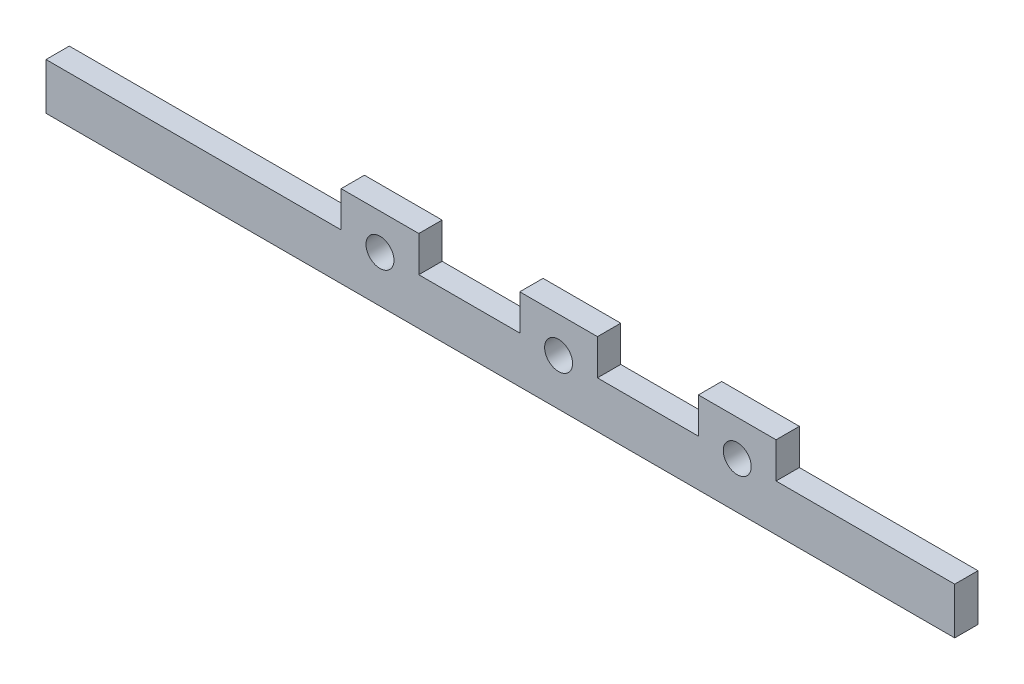
ISO-10303-21;
HEADER;
FILE_DESCRIPTION(('STEP AP214'),'2;1');
FILE_NAME('part.step','',(''),(''),'','','');
FILE_SCHEMA(('AUTOMOTIVE_DESIGN { 1 0 10303 214 1 1 1 1 }'));
ENDSEC;
DATA;
#1=APPLICATION_CONTEXT('core data for automotive mechanical design processes');
#2=APPLICATION_PROTOCOL_DEFINITION('international standard','automotive_design',2000,#1);
#3=PRODUCT_CONTEXT('',#1,'mechanical');
#4=PRODUCT('Part','Part','',(#3));
#5=PRODUCT_RELATED_PRODUCT_CATEGORY('part','',(#4));
#6=PRODUCT_DEFINITION_FORMATION('','',#4);
#7=PRODUCT_DEFINITION_CONTEXT('part definition',#1,'design');
#8=PRODUCT_DEFINITION('design','',#6,#7);
#9=PRODUCT_DEFINITION_SHAPE('','',#8);
#10=(LENGTH_UNIT() NAMED_UNIT(*) SI_UNIT(.MILLI.,.METRE.));
#11=(NAMED_UNIT(*) PLANE_ANGLE_UNIT() SI_UNIT($,.RADIAN.));
#12=(NAMED_UNIT(*) SI_UNIT($,.STERADIAN.) SOLID_ANGLE_UNIT());
#13=UNCERTAINTY_MEASURE_WITH_UNIT(LENGTH_MEASURE(1.E-05),#10,'distance_accuracy_value','');
#14=(GEOMETRIC_REPRESENTATION_CONTEXT(3) GLOBAL_UNCERTAINTY_ASSIGNED_CONTEXT((#13)) GLOBAL_UNIT_ASSIGNED_CONTEXT((#10,
#11,#12)) REPRESENTATION_CONTEXT('',''));
#15=CARTESIAN_POINT('',(0.,0.,0.));
#16=DIRECTION('',(0.,0.,1.));
#17=DIRECTION('',(1.,0.,0.));
#18=AXIS2_PLACEMENT_3D('',#15,#16,#17);
#19=CARTESIAN_POINT('',(0.,0.,15.));
#20=DIRECTION('',(0.,0.,-1.));
#21=DIRECTION('',(-1.,0.,0.));
#22=AXIS2_PLACEMENT_3D('',#19,#20,#21);
#23=PLANE('',#22);
#24=CARTESIAN_POINT('',(-77.5,30.0000000000001,15.));
#25=DIRECTION('',(0.,0.,1.));
#26=DIRECTION('',(1.,0.,0.));
#27=AXIS2_PLACEMENT_3D('',#24,#25,#26);
#28=CIRCLE('',#27,9.00000000000001);
#29=CARTESIAN_POINT('',(-68.4999999999999,30.0000000000001,15.));
#30=VERTEX_POINT('',#29);
#31=EDGE_CURVE('E339',#30,#30,#28,.T.);
#32=ORIENTED_EDGE('',*,*,#31,.F.);
#33=EDGE_LOOP('',(#32));
#34=FACE_BOUND('',#33,.T.);
#35=DIRECTION('',(0.,1.,0.));
#36=VECTOR('',#35,1.);
#37=CARTESIAN_POINT('',(62.5,30.,15.));
#38=LINE('',#37,#36);
#39=CARTESIAN_POINT('',(62.5,30.,15.));
#40=VERTEX_POINT('',#39);
#41=CARTESIAN_POINT('',(62.5,53.,15.));
#42=VERTEX_POINT('',#41);
#43=EDGE_CURVE('E209',#40,#42,#38,.T.);
#44=ORIENTED_EDGE('',*,*,#43,.T.);
#45=DIRECTION('',(-1.,0.,0.));
#46=VECTOR('',#45,1.);
#47=CARTESIAN_POINT('',(12.5,53.,15.));
#48=LINE('',#47,#46);
#49=CARTESIAN_POINT('',(12.5,53.,15.));
#50=VERTEX_POINT('',#49);
#51=EDGE_CURVE('E117',#42,#50,#48,.T.);
#52=ORIENTED_EDGE('',*,*,#51,.T.);
#53=DIRECTION('',(0.,-1.,0.));
#54=VECTOR('',#53,1.);
#55=CARTESIAN_POINT('',(12.5,30.,15.));
#56=LINE('',#55,#54);
#57=CARTESIAN_POINT('',(12.5,30.,15.));
#58=VERTEX_POINT('',#57);
#59=EDGE_CURVE('E248',#50,#58,#56,.T.);
#60=ORIENTED_EDGE('',*,*,#59,.T.);
#61=DIRECTION('',(-1.,0.,0.));
#62=VECTOR('',#61,1.);
#63=CARTESIAN_POINT('',(12.5,30.,15.));
#64=LINE('',#63,#62);
#65=CARTESIAN_POINT('',(-52.5,30.,15.));
#66=VERTEX_POINT('',#65);
#67=EDGE_CURVE('E267',#58,#66,#64,.T.);
#68=ORIENTED_EDGE('',*,*,#67,.T.);
#69=DIRECTION('',(0.,1.,0.));
#70=VECTOR('',#69,1.);
#71=CARTESIAN_POINT('',(-52.5,30.,15.));
#72=LINE('',#71,#70);
#73=CARTESIAN_POINT('',(-52.5,53.,15.));
#74=VERTEX_POINT('',#73);
#75=EDGE_CURVE('E264',#66,#74,#72,.T.);
#76=ORIENTED_EDGE('',*,*,#75,.T.);
#77=DIRECTION('',(-1.,0.,0.));
#78=VECTOR('',#77,1.);
#79=CARTESIAN_POINT('',(-102.5,53.,15.));
#80=LINE('',#79,#78);
#81=CARTESIAN_POINT('',(-102.5,53.,15.));
#82=VERTEX_POINT('',#81);
#83=EDGE_CURVE('E266',#74,#82,#80,.T.);
#84=ORIENTED_EDGE('',*,*,#83,.T.);
#85=DIRECTION('',(0.,-1.,0.));
#86=VECTOR('',#85,1.);
#87=CARTESIAN_POINT('',(-102.5,30.,15.));
#88=LINE('',#87,#86);
#89=CARTESIAN_POINT('',(-102.5,30.,15.));
#90=VERTEX_POINT('',#89);
#91=EDGE_CURVE('E269',#82,#90,#88,.T.);
#92=ORIENTED_EDGE('',*,*,#91,.T.);
#93=DIRECTION('',(-1.,0.,0.));
#94=VECTOR('',#93,1.);
#95=CARTESIAN_POINT('',(-102.5,30.,15.));
#96=LINE('',#95,#94);
#97=CARTESIAN_POINT('',(-292.5,30.,15.));
#98=VERTEX_POINT('',#97);
#99=EDGE_CURVE('E275',#90,#98,#96,.T.);
#100=ORIENTED_EDGE('',*,*,#99,.T.);
#101=DIRECTION('',(0.,-1.,0.));
#102=VECTOR('',#101,1.);
#103=CARTESIAN_POINT('',(-292.5,0.,15.));
#104=LINE('',#103,#102);
#105=CARTESIAN_POINT('',(-292.5,0.,15.));
#106=VERTEX_POINT('',#105);
#107=EDGE_CURVE('E277',#98,#106,#104,.T.);
#108=ORIENTED_EDGE('',*,*,#107,.T.);
#109=DIRECTION('',(1.,0.,0.));
#110=VECTOR('',#109,1.);
#111=CARTESIAN_POINT('',(-292.5,0.,15.));
#112=LINE('',#111,#110);
#113=CARTESIAN_POINT('',(292.5,0.,15.));
#114=VERTEX_POINT('',#113);
#115=EDGE_CURVE('E279',#106,#114,#112,.T.);
#116=ORIENTED_EDGE('',*,*,#115,.T.);
#117=DIRECTION('',(0.,1.,0.));
#118=VECTOR('',#117,1.);
#119=CARTESIAN_POINT('',(292.5,0.,15.));
#120=LINE('',#119,#118);
#121=CARTESIAN_POINT('',(292.5,30.,15.));
#122=VERTEX_POINT('',#121);
#123=EDGE_CURVE('E281',#114,#122,#120,.T.);
#124=ORIENTED_EDGE('',*,*,#123,.T.);
#125=DIRECTION('',(-1.,0.,0.));
#126=VECTOR('',#125,1.);
#127=CARTESIAN_POINT('',(177.5,30.0000000000001,15.));
#128=LINE('',#127,#126);
#129=CARTESIAN_POINT('',(177.5,30.0000000000001,15.));
#130=VERTEX_POINT('',#129);
#131=EDGE_CURVE('E283',#122,#130,#128,.T.);
#132=ORIENTED_EDGE('',*,*,#131,.T.);
#133=DIRECTION('',(0.,1.,0.));
#134=VECTOR('',#133,1.);
#135=CARTESIAN_POINT('',(177.5,30.0000000000001,15.));
#136=LINE('',#135,#134);
#137=CARTESIAN_POINT('',(177.5,53.,15.));
#138=VERTEX_POINT('',#137);
#139=EDGE_CURVE('E160',#130,#138,#136,.T.);
#140=ORIENTED_EDGE('',*,*,#139,.T.);
#141=DIRECTION('',(-1.,0.,0.));
#142=VECTOR('',#141,1.);
#143=CARTESIAN_POINT('',(127.5,53.,15.));
#144=LINE('',#143,#142);
#145=CARTESIAN_POINT('',(127.5,53.,15.));
#146=VERTEX_POINT('',#145);
#147=EDGE_CURVE('E154',#138,#146,#144,.T.);
#148=ORIENTED_EDGE('',*,*,#147,.T.);
#149=DIRECTION('',(0.,-1.,0.));
#150=VECTOR('',#149,1.);
#151=CARTESIAN_POINT('',(127.5,30.0000000000001,15.));
#152=LINE('',#151,#150);
#153=CARTESIAN_POINT('',(127.5,30.0000000000001,15.));
#154=VERTEX_POINT('',#153);
#155=EDGE_CURVE('E158',#146,#154,#152,.T.);
#156=ORIENTED_EDGE('',*,*,#155,.T.);
#157=DIRECTION('',(-1.,0.,0.));
#158=VECTOR('',#157,1.);
#159=CARTESIAN_POINT('',(62.5,30.,15.));
#160=LINE('',#159,#158);
#161=EDGE_CURVE('E50',#154,#40,#160,.T.);
#162=ORIENTED_EDGE('',*,*,#161,.T.);
#163=EDGE_LOOP('',(#44,#52,#60,#68,#76,#84,#92,#100,#108,#116,#124,#132,#140,#148,#156,#162));
#164=FACE_BOUND('',#163,.T.);
#165=CARTESIAN_POINT('',(37.5,30.,15.));
#166=DIRECTION('',(0.,0.,1.));
#167=DIRECTION('',(1.,0.,0.));
#168=AXIS2_PLACEMENT_3D('',#165,#166,#167);
#169=CIRCLE('',#168,9.);
#170=CARTESIAN_POINT('',(46.5,30.,15.));
#171=VERTEX_POINT('',#170);
#172=EDGE_CURVE('E182',#171,#171,#169,.T.);
#173=ORIENTED_EDGE('',*,*,#172,.F.);
#174=EDGE_LOOP('',(#173));
#175=FACE_BOUND('',#174,.T.);
#176=CARTESIAN_POINT('',(152.5,30.0000000000001,15.));
#177=DIRECTION('',(0.,0.,1.));
#178=DIRECTION('',(1.,0.,0.));
#179=AXIS2_PLACEMENT_3D('',#176,#177,#178);
#180=CIRCLE('',#179,9.00000000000001);
#181=CARTESIAN_POINT('',(161.5,30.0000000000001,15.));
#182=VERTEX_POINT('',#181);
#183=EDGE_CURVE('E330',#182,#182,#180,.T.);
#184=ORIENTED_EDGE('',*,*,#183,.F.);
#185=EDGE_LOOP('',(#184));
#186=FACE_BOUND('',#185,.T.);
#187=ADVANCED_FACE('F33',(#34,#164,#175,#186),#23,.F.);
#188=CARTESIAN_POINT('',(0.,0.,0.));
#189=DIRECTION('',(0.,0.,-1.));
#190=DIRECTION('',(-1.,0.,0.));
#191=AXIS2_PLACEMENT_3D('',#188,#189,#190);
#192=PLANE('',#191);
#193=CARTESIAN_POINT('',(-77.5,30.0000000000001,0.));
#194=DIRECTION('',(0.,0.,1.));
#195=DIRECTION('',(1.,0.,0.));
#196=AXIS2_PLACEMENT_3D('',#193,#194,#195);
#197=CIRCLE('',#196,9.00000000000001);
#198=CARTESIAN_POINT('',(-68.4999999999999,30.0000000000001,0.));
#199=VERTEX_POINT('',#198);
#200=EDGE_CURVE('E336',#199,#199,#197,.T.);
#201=ORIENTED_EDGE('',*,*,#200,.T.);
#202=EDGE_LOOP('',(#201));
#203=FACE_BOUND('',#202,.T.);
#204=DIRECTION('',(0.,1.,0.));
#205=VECTOR('',#204,1.);
#206=CARTESIAN_POINT('',(62.5,30.,0.));
#207=LINE('',#206,#205);
#208=CARTESIAN_POINT('',(62.5,30.,0.));
#209=VERTEX_POINT('',#208);
#210=CARTESIAN_POINT('',(62.5,53.,0.));
#211=VERTEX_POINT('',#210);
#212=EDGE_CURVE('E178',#209,#211,#207,.T.);
#213=ORIENTED_EDGE('',*,*,#212,.F.);
#214=DIRECTION('',(-1.,0.,0.));
#215=VECTOR('',#214,1.);
#216=CARTESIAN_POINT('',(62.5,30.,0.));
#217=LINE('',#216,#215);
#218=CARTESIAN_POINT('',(127.5,30.0000000000001,0.));
#219=VERTEX_POINT('',#218);
#220=EDGE_CURVE('E109',#219,#209,#217,.T.);
#221=ORIENTED_EDGE('',*,*,#220,.F.);
#222=DIRECTION('',(0.,-1.,0.));
#223=VECTOR('',#222,1.);
#224=CARTESIAN_POINT('',(127.5,30.0000000000001,0.));
#225=LINE('',#224,#223);
#226=CARTESIAN_POINT('',(127.5,53.,0.));
#227=VERTEX_POINT('',#226);
#228=EDGE_CURVE('E103',#227,#219,#225,.T.);
#229=ORIENTED_EDGE('',*,*,#228,.F.);
#230=DIRECTION('',(-1.,0.,0.));
#231=VECTOR('',#230,1.);
#232=CARTESIAN_POINT('',(127.5,53.,0.));
#233=LINE('',#232,#231);
#234=CARTESIAN_POINT('',(177.5,53.,0.));
#235=VERTEX_POINT('',#234);
#236=EDGE_CURVE('E168',#235,#227,#233,.T.);
#237=ORIENTED_EDGE('',*,*,#236,.F.);
#238=DIRECTION('',(0.,1.,0.));
#239=VECTOR('',#238,1.);
#240=CARTESIAN_POINT('',(177.5,30.0000000000001,0.));
#241=LINE('',#240,#239);
#242=CARTESIAN_POINT('',(177.5,30.0000000000001,0.));
#243=VERTEX_POINT('',#242);
#244=EDGE_CURVE('E204',#243,#235,#241,.T.);
#245=ORIENTED_EDGE('',*,*,#244,.F.);
#246=DIRECTION('',(-1.,0.,0.));
#247=VECTOR('',#246,1.);
#248=CARTESIAN_POINT('',(177.5,30.0000000000001,0.));
#249=LINE('',#248,#247);
#250=CARTESIAN_POINT('',(292.5,30.,0.));
#251=VERTEX_POINT('',#250);
#252=EDGE_CURVE('E202',#251,#243,#249,.T.);
#253=ORIENTED_EDGE('',*,*,#252,.F.);
#254=DIRECTION('',(0.,1.,0.));
#255=VECTOR('',#254,1.);
#256=CARTESIAN_POINT('',(292.5,0.,0.));
#257=LINE('',#256,#255);
#258=CARTESIAN_POINT('',(292.5,0.,0.));
#259=VERTEX_POINT('',#258);
#260=EDGE_CURVE('E200',#259,#251,#257,.T.);
#261=ORIENTED_EDGE('',*,*,#260,.F.);
#262=DIRECTION('',(1.,0.,0.));
#263=VECTOR('',#262,1.);
#264=CARTESIAN_POINT('',(-292.5,0.,0.));
#265=LINE('',#264,#263);
#266=CARTESIAN_POINT('',(-292.5,0.,0.));
#267=VERTEX_POINT('',#266);
#268=EDGE_CURVE('E198',#267,#259,#265,.T.);
#269=ORIENTED_EDGE('',*,*,#268,.F.);
#270=DIRECTION('',(0.,-1.,0.));
#271=VECTOR('',#270,1.);
#272=CARTESIAN_POINT('',(-292.5,0.,0.));
#273=LINE('',#272,#271);
#274=CARTESIAN_POINT('',(-292.5,30.,0.));
#275=VERTEX_POINT('',#274);
#276=EDGE_CURVE('E196',#275,#267,#273,.T.);
#277=ORIENTED_EDGE('',*,*,#276,.F.);
#278=DIRECTION('',(-1.,0.,0.));
#279=VECTOR('',#278,1.);
#280=CARTESIAN_POINT('',(-102.5,30.,0.));
#281=LINE('',#280,#279);
#282=CARTESIAN_POINT('',(-102.5,30.,0.));
#283=VERTEX_POINT('',#282);
#284=EDGE_CURVE('E194',#283,#275,#281,.T.);
#285=ORIENTED_EDGE('',*,*,#284,.F.);
#286=DIRECTION('',(0.,-1.,0.));
#287=VECTOR('',#286,1.);
#288=CARTESIAN_POINT('',(-102.5,30.,0.));
#289=LINE('',#288,#287);
#290=CARTESIAN_POINT('',(-102.5,53.,0.));
#291=VERTEX_POINT('',#290);
#292=EDGE_CURVE('E192',#291,#283,#289,.T.);
#293=ORIENTED_EDGE('',*,*,#292,.F.);
#294=DIRECTION('',(-1.,0.,0.));
#295=VECTOR('',#294,1.);
#296=CARTESIAN_POINT('',(-102.5,53.,0.));
#297=LINE('',#296,#295);
#298=CARTESIAN_POINT('',(-52.5,53.,0.));
#299=VERTEX_POINT('',#298);
#300=EDGE_CURVE('E190',#299,#291,#297,.T.);
#301=ORIENTED_EDGE('',*,*,#300,.F.);
#302=DIRECTION('',(0.,1.,0.));
#303=VECTOR('',#302,1.);
#304=CARTESIAN_POINT('',(-52.5,30.,0.));
#305=LINE('',#304,#303);
#306=CARTESIAN_POINT('',(-52.5,30.,0.));
#307=VERTEX_POINT('',#306);
#308=EDGE_CURVE('E188',#307,#299,#305,.T.);
#309=ORIENTED_EDGE('',*,*,#308,.F.);
#310=DIRECTION('',(-1.,0.,0.));
#311=VECTOR('',#310,1.);
#312=CARTESIAN_POINT('',(12.5,30.,0.));
#313=LINE('',#312,#311);
#314=CARTESIAN_POINT('',(12.5,30.,0.));
#315=VERTEX_POINT('',#314);
#316=EDGE_CURVE('E186',#315,#307,#313,.T.);
#317=ORIENTED_EDGE('',*,*,#316,.F.);
#318=DIRECTION('',(0.,-1.,0.));
#319=VECTOR('',#318,1.);
#320=CARTESIAN_POINT('',(12.5,30.,0.));
#321=LINE('',#320,#319);
#322=CARTESIAN_POINT('',(12.5,53.,0.));
#323=VERTEX_POINT('',#322);
#324=EDGE_CURVE('E184',#323,#315,#321,.T.);
#325=ORIENTED_EDGE('',*,*,#324,.F.);
#326=DIRECTION('',(-1.,0.,0.));
#327=VECTOR('',#326,1.);
#328=CARTESIAN_POINT('',(12.5,53.,0.));
#329=LINE('',#328,#327);
#330=EDGE_CURVE('E181',#211,#323,#329,.T.);
#331=ORIENTED_EDGE('',*,*,#330,.F.);
#332=EDGE_LOOP('',(#213,#221,#229,#237,#245,#253,#261,#269,#277,#285,#293,#301,#309,#317,#325,#331));
#333=FACE_BOUND('',#332,.T.);
#334=CARTESIAN_POINT('',(37.5,30.,0.));
#335=DIRECTION('',(0.,0.,1.));
#336=DIRECTION('',(1.,0.,0.));
#337=AXIS2_PLACEMENT_3D('',#334,#335,#336);
#338=CIRCLE('',#337,9.);
#339=CARTESIAN_POINT('',(46.5,30.,0.));
#340=VERTEX_POINT('',#339);
#341=EDGE_CURVE('E342',#340,#340,#338,.T.);
#342=ORIENTED_EDGE('',*,*,#341,.T.);
#343=EDGE_LOOP('',(#342));
#344=FACE_BOUND('',#343,.T.);
#345=CARTESIAN_POINT('',(152.5,30.0000000000001,0.));
#346=DIRECTION('',(0.,0.,1.));
#347=DIRECTION('',(1.,0.,0.));
#348=AXIS2_PLACEMENT_3D('',#345,#346,#347);
#349=CIRCLE('',#348,9.00000000000001);
#350=CARTESIAN_POINT('',(161.5,30.0000000000001,0.));
#351=VERTEX_POINT('',#350);
#352=EDGE_CURVE('E333',#351,#351,#349,.T.);
#353=ORIENTED_EDGE('',*,*,#352,.T.);
#354=EDGE_LOOP('',(#353));
#355=FACE_BOUND('',#354,.T.);
#356=ADVANCED_FACE('F252',(#203,#333,#344,#355),#192,.T.);
#357=CARTESIAN_POINT('',(62.5,30.,15.));
#358=DIRECTION('',(-1.,0.,0.));
#359=DIRECTION('',(0.,0.,1.));
#360=AXIS2_PLACEMENT_3D('',#357,#358,#359);
#361=PLANE('',#360);
#362=ORIENTED_EDGE('',*,*,#212,.T.);
#363=DIRECTION('',(0.,0.,-1.));
#364=VECTOR('',#363,1.);
#365=CARTESIAN_POINT('',(62.5,53.,15.));
#366=LINE('',#365,#364);
#367=EDGE_CURVE('E11',#42,#211,#366,.T.);
#368=ORIENTED_EDGE('',*,*,#367,.F.);
#369=ORIENTED_EDGE('',*,*,#43,.F.);
#370=DIRECTION('',(0.,0.,-1.));
#371=VECTOR('',#370,1.);
#372=CARTESIAN_POINT('',(62.5,30.,15.));
#373=LINE('',#372,#371);
#374=EDGE_CURVE('E174',#40,#209,#373,.T.);
#375=ORIENTED_EDGE('',*,*,#374,.T.);
#376=EDGE_LOOP('',(#362,#368,#369,#375));
#377=FACE_BOUND('',#376,.T.);
#378=ADVANCED_FACE('F35',(#377),#361,.F.);
#379=CARTESIAN_POINT('',(12.5,53.,15.));
#380=DIRECTION('',(0.,-1.,0.));
#381=DIRECTION('',(0.,0.,-1.));
#382=AXIS2_PLACEMENT_3D('',#379,#380,#381);
#383=PLANE('',#382);
#384=ORIENTED_EDGE('',*,*,#330,.T.);
#385=DIRECTION('',(0.,0.,-1.));
#386=VECTOR('',#385,1.);
#387=CARTESIAN_POINT('',(12.5,53.,15.));
#388=LINE('',#387,#386);
#389=EDGE_CURVE('E42',#50,#323,#388,.T.);
#390=ORIENTED_EDGE('',*,*,#389,.F.);
#391=ORIENTED_EDGE('',*,*,#51,.F.);
#392=ORIENTED_EDGE('',*,*,#367,.T.);
#393=EDGE_LOOP('',(#384,#390,#391,#392));
#394=FACE_BOUND('',#393,.T.);
#395=ADVANCED_FACE('F483',(#394),#383,.F.);
#396=CARTESIAN_POINT('',(12.5,30.,15.));
#397=DIRECTION('',(1.,0.,0.));
#398=DIRECTION('',(0.,0.,-1.));
#399=AXIS2_PLACEMENT_3D('',#396,#397,#398);
#400=PLANE('',#399);
#401=ORIENTED_EDGE('',*,*,#324,.T.);
#402=DIRECTION('',(0.,0.,-1.));
#403=VECTOR('',#402,1.);
#404=CARTESIAN_POINT('',(12.5,30.,15.));
#405=LINE('',#404,#403);
#406=EDGE_CURVE('E240',#58,#315,#405,.T.);
#407=ORIENTED_EDGE('',*,*,#406,.F.);
#408=ORIENTED_EDGE('',*,*,#59,.F.);
#409=ORIENTED_EDGE('',*,*,#389,.T.);
#410=EDGE_LOOP('',(#401,#407,#408,#409));
#411=FACE_BOUND('',#410,.T.);
#412=ADVANCED_FACE('F246',(#411),#400,.F.);
#413=CARTESIAN_POINT('',(12.5,30.,15.));
#414=DIRECTION('',(0.,-1.,0.));
#415=DIRECTION('',(1.,0.,0.));
#416=AXIS2_PLACEMENT_3D('',#413,#414,#415);
#417=PLANE('',#416);
#418=ORIENTED_EDGE('',*,*,#316,.T.);
#419=DIRECTION('',(0.,0.,-1.));
#420=VECTOR('',#419,1.);
#421=CARTESIAN_POINT('',(-52.5,30.,15.));
#422=LINE('',#421,#420);
#423=EDGE_CURVE('E237',#66,#307,#422,.T.);
#424=ORIENTED_EDGE('',*,*,#423,.F.);
#425=ORIENTED_EDGE('',*,*,#67,.F.);
#426=ORIENTED_EDGE('',*,*,#406,.T.);
#427=EDGE_LOOP('',(#418,#424,#425,#426));
#428=FACE_BOUND('',#427,.T.);
#429=ADVANCED_FACE('F258',(#428),#417,.F.);
#430=CARTESIAN_POINT('',(-52.5,30.,15.));
#431=DIRECTION('',(-1.,0.,0.));
#432=DIRECTION('',(0.,0.,1.));
#433=AXIS2_PLACEMENT_3D('',#430,#431,#432);
#434=PLANE('',#433);
#435=ORIENTED_EDGE('',*,*,#308,.T.);
#436=DIRECTION('',(0.,0.,-1.));
#437=VECTOR('',#436,1.);
#438=CARTESIAN_POINT('',(-52.5,53.,15.));
#439=LINE('',#438,#437);
#440=EDGE_CURVE('E234',#74,#299,#439,.T.);
#441=ORIENTED_EDGE('',*,*,#440,.F.);
#442=ORIENTED_EDGE('',*,*,#75,.F.);
#443=ORIENTED_EDGE('',*,*,#423,.T.);
#444=EDGE_LOOP('',(#435,#441,#442,#443));
#445=FACE_BOUND('',#444,.T.);
#446=ADVANCED_FACE('F262',(#445),#434,.F.);
#447=CARTESIAN_POINT('',(-102.5,53.,15.));
#448=DIRECTION('',(0.,-1.,0.));
#449=DIRECTION('',(0.,0.,-1.));
#450=AXIS2_PLACEMENT_3D('',#447,#448,#449);
#451=PLANE('',#450);
#452=ORIENTED_EDGE('',*,*,#300,.T.);
#453=DIRECTION('',(0.,0.,-1.));
#454=VECTOR('',#453,1.);
#455=CARTESIAN_POINT('',(-102.5,53.,15.));
#456=LINE('',#455,#454);
#457=EDGE_CURVE('E231',#82,#291,#456,.T.);
#458=ORIENTED_EDGE('',*,*,#457,.F.);
#459=ORIENTED_EDGE('',*,*,#83,.F.);
#460=ORIENTED_EDGE('',*,*,#440,.T.);
#461=EDGE_LOOP('',(#452,#458,#459,#460));
#462=FACE_BOUND('',#461,.T.);
#463=ADVANCED_FACE('F448',(#462),#451,.F.);
#464=CARTESIAN_POINT('',(-102.5,30.,15.));
#465=DIRECTION('',(1.,0.,0.));
#466=DIRECTION('',(0.,0.,-1.));
#467=AXIS2_PLACEMENT_3D('',#464,#465,#466);
#468=PLANE('',#467);
#469=ORIENTED_EDGE('',*,*,#292,.T.);
#470=DIRECTION('',(0.,0.,-1.));
#471=VECTOR('',#470,1.);
#472=CARTESIAN_POINT('',(-102.5,30.,15.));
#473=LINE('',#472,#471);
#474=EDGE_CURVE('E228',#90,#283,#473,.T.);
#475=ORIENTED_EDGE('',*,*,#474,.F.);
#476=ORIENTED_EDGE('',*,*,#91,.F.);
#477=ORIENTED_EDGE('',*,*,#457,.T.);
#478=EDGE_LOOP('',(#469,#475,#476,#477));
#479=FACE_BOUND('',#478,.T.);
#480=ADVANCED_FACE('F438',(#479),#468,.F.);
#481=CARTESIAN_POINT('',(-102.5,30.,15.));
#482=DIRECTION('',(0.,-1.,0.));
#483=DIRECTION('',(1.,0.,0.));
#484=AXIS2_PLACEMENT_3D('',#481,#482,#483);
#485=PLANE('',#484);
#486=ORIENTED_EDGE('',*,*,#284,.T.);
#487=DIRECTION('',(0.,0.,-1.));
#488=VECTOR('',#487,1.);
#489=CARTESIAN_POINT('',(-292.5,30.,15.));
#490=LINE('',#489,#488);
#491=EDGE_CURVE('E225',#98,#275,#490,.T.);
#492=ORIENTED_EDGE('',*,*,#491,.F.);
#493=ORIENTED_EDGE('',*,*,#99,.F.);
#494=ORIENTED_EDGE('',*,*,#474,.T.);
#495=EDGE_LOOP('',(#486,#492,#493,#494));
#496=FACE_BOUND('',#495,.T.);
#497=ADVANCED_FACE('F428',(#496),#485,.F.);
#498=CARTESIAN_POINT('',(-292.5,0.,15.));
#499=DIRECTION('',(1.,0.,0.));
#500=DIRECTION('',(0.,0.,-1.));
#501=AXIS2_PLACEMENT_3D('',#498,#499,#500);
#502=PLANE('',#501);
#503=ORIENTED_EDGE('',*,*,#276,.T.);
#504=DIRECTION('',(0.,0.,-1.));
#505=VECTOR('',#504,1.);
#506=CARTESIAN_POINT('',(-292.5,0.,15.));
#507=LINE('',#506,#505);
#508=EDGE_CURVE('E222',#106,#267,#507,.T.);
#509=ORIENTED_EDGE('',*,*,#508,.F.);
#510=ORIENTED_EDGE('',*,*,#107,.F.);
#511=ORIENTED_EDGE('',*,*,#491,.T.);
#512=EDGE_LOOP('',(#503,#509,#510,#511));
#513=FACE_BOUND('',#512,.T.);
#514=ADVANCED_FACE('F418',(#513),#502,.F.);
#515=CARTESIAN_POINT('',(-292.5,0.,15.));
#516=DIRECTION('',(0.,1.,0.));
#517=DIRECTION('',(0.,0.,1.));
#518=AXIS2_PLACEMENT_3D('',#515,#516,#517);
#519=PLANE('',#518);
#520=ORIENTED_EDGE('',*,*,#268,.T.);
#521=DIRECTION('',(0.,0.,-1.));
#522=VECTOR('',#521,1.);
#523=CARTESIAN_POINT('',(292.5,0.,15.));
#524=LINE('',#523,#522);
#525=EDGE_CURVE('E219',#114,#259,#524,.T.);
#526=ORIENTED_EDGE('',*,*,#525,.F.);
#527=ORIENTED_EDGE('',*,*,#115,.F.);
#528=ORIENTED_EDGE('',*,*,#508,.T.);
#529=EDGE_LOOP('',(#520,#526,#527,#528));
#530=FACE_BOUND('',#529,.T.);
#531=ADVANCED_FACE('F408',(#530),#519,.F.);
#532=CARTESIAN_POINT('',(292.5,0.,15.));
#533=DIRECTION('',(-1.,0.,0.));
#534=DIRECTION('',(0.,0.,1.));
#535=AXIS2_PLACEMENT_3D('',#532,#533,#534);
#536=PLANE('',#535);
#537=ORIENTED_EDGE('',*,*,#260,.T.);
#538=DIRECTION('',(0.,0.,-1.));
#539=VECTOR('',#538,1.);
#540=CARTESIAN_POINT('',(292.5,30.,15.));
#541=LINE('',#540,#539);
#542=EDGE_CURVE('E216',#122,#251,#541,.T.);
#543=ORIENTED_EDGE('',*,*,#542,.F.);
#544=ORIENTED_EDGE('',*,*,#123,.F.);
#545=ORIENTED_EDGE('',*,*,#525,.T.);
#546=EDGE_LOOP('',(#537,#543,#544,#545));
#547=FACE_BOUND('',#546,.T.);
#548=ADVANCED_FACE('F399',(#547),#536,.F.);
#549=CARTESIAN_POINT('',(177.5,30.0000000000001,15.));
#550=DIRECTION('',(0.,-1.,0.));
#551=DIRECTION('',(1.,0.,0.));
#552=AXIS2_PLACEMENT_3D('',#549,#550,#551);
#553=PLANE('',#552);
#554=ORIENTED_EDGE('',*,*,#252,.T.);
#555=DIRECTION('',(0.,0.,-1.));
#556=VECTOR('',#555,1.);
#557=CARTESIAN_POINT('',(177.5,30.0000000000001,15.));
#558=LINE('',#557,#556);
#559=EDGE_CURVE('E213',#130,#243,#558,.T.);
#560=ORIENTED_EDGE('',*,*,#559,.F.);
#561=ORIENTED_EDGE('',*,*,#131,.F.);
#562=ORIENTED_EDGE('',*,*,#542,.T.);
#563=EDGE_LOOP('',(#554,#560,#561,#562));
#564=FACE_BOUND('',#563,.T.);
#565=ADVANCED_FACE('F289',(#564),#553,.F.);
#566=CARTESIAN_POINT('',(177.5,30.0000000000001,15.));
#567=DIRECTION('',(-1.,0.,0.));
#568=DIRECTION('',(0.,0.,1.));
#569=AXIS2_PLACEMENT_3D('',#566,#567,#568);
#570=PLANE('',#569);
#571=ORIENTED_EDGE('',*,*,#244,.T.);
#572=DIRECTION('',(0.,0.,-1.));
#573=VECTOR('',#572,1.);
#574=CARTESIAN_POINT('',(177.5,53.,15.));
#575=LINE('',#574,#573);
#576=EDGE_CURVE('E169',#138,#235,#575,.T.);
#577=ORIENTED_EDGE('',*,*,#576,.F.);
#578=ORIENTED_EDGE('',*,*,#139,.F.);
#579=ORIENTED_EDGE('',*,*,#559,.T.);
#580=EDGE_LOOP('',(#571,#577,#578,#579));
#581=FACE_BOUND('',#580,.T.);
#582=ADVANCED_FACE('F293',(#581),#570,.F.);
#583=CARTESIAN_POINT('',(127.5,53.,15.));
#584=DIRECTION('',(0.,-1.,0.));
#585=DIRECTION('',(1.,0.,0.));
#586=AXIS2_PLACEMENT_3D('',#583,#584,#585);
#587=PLANE('',#586);
#588=ORIENTED_EDGE('',*,*,#236,.T.);
#589=DIRECTION('',(0.,0.,-1.));
#590=VECTOR('',#589,1.);
#591=CARTESIAN_POINT('',(127.5,53.,15.));
#592=LINE('',#591,#590);
#593=EDGE_CURVE('E165',#146,#227,#592,.T.);
#594=ORIENTED_EDGE('',*,*,#593,.F.);
#595=ORIENTED_EDGE('',*,*,#147,.F.);
#596=ORIENTED_EDGE('',*,*,#576,.T.);
#597=EDGE_LOOP('',(#588,#594,#595,#596));
#598=FACE_BOUND('',#597,.T.);
#599=ADVANCED_FACE('F166',(#598),#587,.F.);
#600=CARTESIAN_POINT('',(127.5,30.0000000000001,15.));
#601=DIRECTION('',(1.,0.,0.));
#602=DIRECTION('',(0.,0.,-1.));
#603=AXIS2_PLACEMENT_3D('',#600,#601,#602);
#604=PLANE('',#603);
#605=ORIENTED_EDGE('',*,*,#228,.T.);
#606=DIRECTION('',(0.,0.,-1.));
#607=VECTOR('',#606,1.);
#608=CARTESIAN_POINT('',(127.5,30.0000000000001,15.));
#609=LINE('',#608,#607);
#610=EDGE_CURVE('E170',#154,#219,#609,.T.);
#611=ORIENTED_EDGE('',*,*,#610,.F.);
#612=ORIENTED_EDGE('',*,*,#155,.F.);
#613=ORIENTED_EDGE('',*,*,#593,.T.);
#614=EDGE_LOOP('',(#605,#611,#612,#613));
#615=FACE_BOUND('',#614,.T.);
#616=ADVANCED_FACE('F172',(#615),#604,.F.);
#617=CARTESIAN_POINT('',(62.5,30.,15.));
#618=DIRECTION('',(0.,-1.,0.));
#619=DIRECTION('',(1.,0.,0.));
#620=AXIS2_PLACEMENT_3D('',#617,#618,#619);
#621=PLANE('',#620);
#622=ORIENTED_EDGE('',*,*,#220,.T.);
#623=ORIENTED_EDGE('',*,*,#374,.F.);
#624=ORIENTED_EDGE('',*,*,#161,.F.);
#625=ORIENTED_EDGE('',*,*,#610,.T.);
#626=EDGE_LOOP('',(#622,#623,#624,#625));
#627=FACE_BOUND('',#626,.T.);
#628=ADVANCED_FACE('F297',(#627),#621,.F.);
#629=CARTESIAN_POINT('',(37.5,30.,15.));
#630=DIRECTION('',(0.,0.,-1.));
#631=DIRECTION('',(-1.,0.,0.));
#632=AXIS2_PLACEMENT_3D('',#629,#630,#631);
#633=CYLINDRICAL_SURFACE('',#632,9.);
#634=ORIENTED_EDGE('',*,*,#172,.T.);
#635=EDGE_LOOP('',(#634));
#636=FACE_BOUND('',#635,.T.);
#637=ORIENTED_EDGE('',*,*,#341,.F.);
#638=EDGE_LOOP('',(#637));
#639=FACE_BOUND('',#638,.T.);
#640=ADVANCED_FACE('F299',(#636,#639),#633,.F.);
#641=CARTESIAN_POINT('',(-77.5,30.0000000000001,15.));
#642=DIRECTION('',(0.,0.,-1.));
#643=DIRECTION('',(-1.,0.,0.));
#644=AXIS2_PLACEMENT_3D('',#641,#642,#643);
#645=CYLINDRICAL_SURFACE('',#644,9.00000000000001);
#646=ORIENTED_EDGE('',*,*,#31,.T.);
#647=EDGE_LOOP('',(#646));
#648=FACE_BOUND('',#647,.T.);
#649=ORIENTED_EDGE('',*,*,#200,.F.);
#650=EDGE_LOOP('',(#649));
#651=FACE_BOUND('',#650,.T.);
#652=ADVANCED_FACE('F305',(#648,#651),#645,.F.);
#653=CARTESIAN_POINT('',(152.5,30.0000000000001,15.));
#654=DIRECTION('',(0.,0.,-1.));
#655=DIRECTION('',(-1.,0.,0.));
#656=AXIS2_PLACEMENT_3D('',#653,#654,#655);
#657=CYLINDRICAL_SURFACE('',#656,9.00000000000001);
#658=ORIENTED_EDGE('',*,*,#183,.T.);
#659=EDGE_LOOP('',(#658));
#660=FACE_BOUND('',#659,.T.);
#661=ORIENTED_EDGE('',*,*,#352,.F.);
#662=EDGE_LOOP('',(#661));
#663=FACE_BOUND('',#662,.T.);
#664=ADVANCED_FACE('F321',(#660,#663),#657,.F.);
#665=CLOSED_SHELL('',(#187,#356,#378,#395,#412,#429,#446,#463,#480,#497,#514,#531,#548,#565,
#582,#599,#616,#628,#640,#652,#664));
#666=MANIFOLD_SOLID_BREP('B2',#665);
#667=ADVANCED_BREP_SHAPE_REPRESENTATION('',(#18,#666),#14);
#668=SHAPE_DEFINITION_REPRESENTATION(#9,#667);
ENDSEC;
END-ISO-10303-21;
